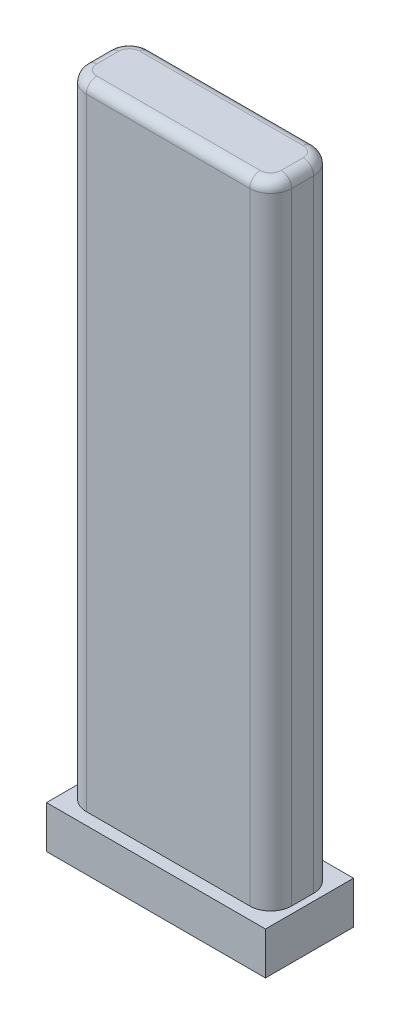
ISO-10303-21;
HEADER;
FILE_DESCRIPTION(('STEP AP214'),'2;1');
FILE_NAME('part.step','',(''),(''),'','','');
FILE_SCHEMA(('AUTOMOTIVE_DESIGN { 1 0 10303 214 1 1 1 1 }'));
ENDSEC;
DATA;
#1=APPLICATION_CONTEXT('core data for automotive mechanical design processes');
#2=APPLICATION_PROTOCOL_DEFINITION('international standard','automotive_design',2000,#1);
#3=PRODUCT_CONTEXT('',#1,'mechanical');
#4=PRODUCT('Part','Part','',(#3));
#5=PRODUCT_RELATED_PRODUCT_CATEGORY('part','',(#4));
#6=PRODUCT_DEFINITION_FORMATION('','',#4);
#7=PRODUCT_DEFINITION_CONTEXT('part definition',#1,'design');
#8=PRODUCT_DEFINITION('design','',#6,#7);
#9=PRODUCT_DEFINITION_SHAPE('','',#8);
#10=(LENGTH_UNIT() NAMED_UNIT(*) SI_UNIT(.MILLI.,.METRE.));
#11=(NAMED_UNIT(*) PLANE_ANGLE_UNIT() SI_UNIT($,.RADIAN.));
#12=(NAMED_UNIT(*) SI_UNIT($,.STERADIAN.) SOLID_ANGLE_UNIT());
#13=UNCERTAINTY_MEASURE_WITH_UNIT(LENGTH_MEASURE(1.E-05),#10,'distance_accuracy_value','');
#14=(GEOMETRIC_REPRESENTATION_CONTEXT(3) GLOBAL_UNCERTAINTY_ASSIGNED_CONTEXT((#13)) GLOBAL_UNIT_ASSIGNED_CONTEXT((#10,
#11,#12)) REPRESENTATION_CONTEXT('',''));
#15=CARTESIAN_POINT('',(0.,0.,0.));
#16=DIRECTION('',(0.,0.,1.));
#17=DIRECTION('',(1.,0.,0.));
#18=AXIS2_PLACEMENT_3D('',#15,#16,#17);
#19=CARTESIAN_POINT('',(7.80000000000001,60.3,1.05));
#20=DIRECTION('',(0.,-1.,0.));
#21=DIRECTION('',(0.,0.,-1.));
#22=AXIS2_PLACEMENT_3D('',#19,#20,#21);
#23=CYLINDRICAL_SURFACE('',#22,2.);
#24=DIRECTION('',(0.,-1.,0.));
#25=VECTOR('',#24,1.);
#26=CARTESIAN_POINT('',(9.80000000000001,60.3,1.05));
#27=LINE('',#26,#25);
#28=CARTESIAN_POINT('',(9.80000000000001,59.3,1.05));
#29=VERTEX_POINT('',#28);
#30=CARTESIAN_POINT('',(9.80000000000001,0.,1.05));
#31=VERTEX_POINT('',#30);
#32=EDGE_CURVE('E237',#29,#31,#27,.T.);
#33=ORIENTED_EDGE('',*,*,#32,.F.);
#34=CARTESIAN_POINT('',(7.80000000000001,59.3,1.05));
#35=DIRECTION('',(0.,1.,0.));
#36=DIRECTION('',(0.,0.,1.));
#37=AXIS2_PLACEMENT_3D('',#34,#35,#36);
#38=CIRCLE('',#37,2.);
#39=CARTESIAN_POINT('',(7.80000000000001,59.3,3.05));
#40=VERTEX_POINT('',#39);
#41=EDGE_CURVE('E272',#29,#40,#38,.F.);
#42=ORIENTED_EDGE('',*,*,#41,.T.);
#43=DIRECTION('',(0.,-1.,0.));
#44=VECTOR('',#43,1.);
#45=CARTESIAN_POINT('',(7.80000000000001,60.3,3.05));
#46=LINE('',#45,#44);
#47=CARTESIAN_POINT('',(7.80000000000001,0.,3.05));
#48=VERTEX_POINT('',#47);
#49=EDGE_CURVE('E224',#40,#48,#46,.T.);
#50=ORIENTED_EDGE('',*,*,#49,.T.);
#51=CARTESIAN_POINT('',(7.80000000000001,0.,1.05));
#52=DIRECTION('',(0.,1.,0.));
#53=DIRECTION('',(0.,0.,1.));
#54=AXIS2_PLACEMENT_3D('',#51,#52,#53);
#55=CIRCLE('',#54,2.);
#56=EDGE_CURVE('E198',#48,#31,#55,.T.);
#57=ORIENTED_EDGE('',*,*,#56,.T.);
#58=EDGE_LOOP('',(#33,#42,#50,#57));
#59=FACE_BOUND('',#58,.T.);
#60=ADVANCED_FACE('F41',(#59),#23,.T.);
#61=CARTESIAN_POINT('',(9.8,60.3,-1.05));
#62=DIRECTION('',(-1.,0.,0.));
#63=DIRECTION('',(0.,0.,1.));
#64=AXIS2_PLACEMENT_3D('',#61,#62,#63);
#65=PLANE('',#64);
#66=DIRECTION('',(0.,-1.,0.));
#67=VECTOR('',#66,1.);
#68=CARTESIAN_POINT('',(9.8,60.3,-1.05));
#69=LINE('',#68,#67);
#70=CARTESIAN_POINT('',(9.8,59.3,-1.05));
#71=VERTEX_POINT('',#70);
#72=CARTESIAN_POINT('',(9.8,0.,-1.05));
#73=VERTEX_POINT('',#72);
#74=EDGE_CURVE('E240',#71,#73,#69,.T.);
#75=ORIENTED_EDGE('',*,*,#74,.F.);
#76=DIRECTION('',(0.,0.,-1.));
#77=VECTOR('',#76,1.);
#78=CARTESIAN_POINT('',(9.80000000000001,59.3,1.05));
#79=LINE('',#78,#77);
#80=EDGE_CURVE('E268',#71,#29,#79,.F.);
#81=ORIENTED_EDGE('',*,*,#80,.T.);
#82=ORIENTED_EDGE('',*,*,#32,.T.);
#83=DIRECTION('',(0.,0.,-1.));
#84=VECTOR('',#83,1.);
#85=CARTESIAN_POINT('',(9.8,0.,-1.05));
#86=LINE('',#85,#84);
#87=EDGE_CURVE('E203',#31,#73,#86,.T.);
#88=ORIENTED_EDGE('',*,*,#87,.T.);
#89=EDGE_LOOP('',(#75,#81,#82,#88));
#90=FACE_BOUND('',#89,.T.);
#91=ADVANCED_FACE('F344',(#90),#65,.F.);
#92=CARTESIAN_POINT('',(7.80000000000001,60.3,-1.05));
#93=DIRECTION('',(0.,-1.,0.));
#94=DIRECTION('',(0.,0.,-1.));
#95=AXIS2_PLACEMENT_3D('',#92,#93,#94);
#96=CYLINDRICAL_SURFACE('',#95,2.);
#97=DIRECTION('',(0.,-1.,0.));
#98=VECTOR('',#97,1.);
#99=CARTESIAN_POINT('',(7.80000000000001,60.3,-3.05));
#100=LINE('',#99,#98);
#101=CARTESIAN_POINT('',(7.80000000000001,59.3,-3.05));
#102=VERTEX_POINT('',#101);
#103=CARTESIAN_POINT('',(7.80000000000001,0.,-3.05));
#104=VERTEX_POINT('',#103);
#105=EDGE_CURVE('E232',#102,#104,#100,.T.);
#106=ORIENTED_EDGE('',*,*,#105,.F.);
#107=CARTESIAN_POINT('',(7.80000000000001,59.3,-1.05));
#108=DIRECTION('',(0.,1.,0.));
#109=DIRECTION('',(0.,0.,1.));
#110=AXIS2_PLACEMENT_3D('',#107,#108,#109);
#111=CIRCLE('',#110,2.);
#112=EDGE_CURVE('E270',#102,#71,#111,.F.);
#113=ORIENTED_EDGE('',*,*,#112,.T.);
#114=ORIENTED_EDGE('',*,*,#74,.T.);
#115=CARTESIAN_POINT('',(7.80000000000001,0.,-1.05));
#116=DIRECTION('',(0.,1.,0.));
#117=DIRECTION('',(0.,0.,-1.));
#118=AXIS2_PLACEMENT_3D('',#115,#116,#117);
#119=CIRCLE('',#118,2.);
#120=EDGE_CURVE('E210',#73,#104,#119,.T.);
#121=ORIENTED_EDGE('',*,*,#120,.T.);
#122=EDGE_LOOP('',(#106,#113,#114,#121));
#123=FACE_BOUND('',#122,.T.);
#124=ADVANCED_FACE('F355',(#123),#96,.T.);
#125=CARTESIAN_POINT('',(-7.8,60.3,-3.05));
#126=DIRECTION('',(0.,0.,1.));
#127=DIRECTION('',(1.,0.,0.));
#128=AXIS2_PLACEMENT_3D('',#125,#126,#127);
#129=PLANE('',#128);
#130=DIRECTION('',(0.,-1.,0.));
#131=VECTOR('',#130,1.);
#132=CARTESIAN_POINT('',(-7.8,60.3,-3.05));
#133=LINE('',#132,#131);
#134=CARTESIAN_POINT('',(-7.8,59.3,-3.05));
#135=VERTEX_POINT('',#134);
#136=CARTESIAN_POINT('',(-7.8,0.,-3.05));
#137=VERTEX_POINT('',#136);
#138=EDGE_CURVE('E231',#135,#137,#133,.T.);
#139=ORIENTED_EDGE('',*,*,#138,.F.);
#140=DIRECTION('',(-1.,0.,0.));
#141=VECTOR('',#140,1.);
#142=CARTESIAN_POINT('',(7.80000000000001,59.3,-3.05));
#143=LINE('',#142,#141);
#144=EDGE_CURVE('E264',#135,#102,#143,.F.);
#145=ORIENTED_EDGE('',*,*,#144,.T.);
#146=ORIENTED_EDGE('',*,*,#105,.T.);
#147=DIRECTION('',(-1.,0.,0.));
#148=VECTOR('',#147,1.);
#149=CARTESIAN_POINT('',(-7.8,0.,-3.05));
#150=LINE('',#149,#148);
#151=EDGE_CURVE('E208',#104,#137,#150,.T.);
#152=ORIENTED_EDGE('',*,*,#151,.T.);
#153=EDGE_LOOP('',(#139,#145,#146,#152));
#154=FACE_BOUND('',#153,.T.);
#155=ADVANCED_FACE('F496',(#154),#129,.F.);
#156=CARTESIAN_POINT('',(-7.8,60.3,-1.05));
#157=DIRECTION('',(0.,-1.,0.));
#158=DIRECTION('',(0.,0.,-1.));
#159=AXIS2_PLACEMENT_3D('',#156,#157,#158);
#160=CYLINDRICAL_SURFACE('',#159,2.);
#161=DIRECTION('',(0.,-1.,0.));
#162=VECTOR('',#161,1.);
#163=CARTESIAN_POINT('',(-9.8,60.3,-1.05));
#164=LINE('',#163,#162);
#165=CARTESIAN_POINT('',(-9.8,59.3,-1.05));
#166=VERTEX_POINT('',#165);
#167=CARTESIAN_POINT('',(-9.8,0.,-1.05));
#168=VERTEX_POINT('',#167);
#169=EDGE_CURVE('E233',#166,#168,#164,.T.);
#170=ORIENTED_EDGE('',*,*,#169,.F.);
#171=CARTESIAN_POINT('',(-7.8,59.3,-1.05));
#172=DIRECTION('',(0.,1.,0.));
#173=DIRECTION('',(0.,0.,1.));
#174=AXIS2_PLACEMENT_3D('',#171,#172,#173);
#175=CIRCLE('',#174,2.);
#176=EDGE_CURVE('E263',#166,#135,#175,.F.);
#177=ORIENTED_EDGE('',*,*,#176,.T.);
#178=ORIENTED_EDGE('',*,*,#138,.T.);
#179=CARTESIAN_POINT('',(-7.8,0.,-1.05));
#180=DIRECTION('',(0.,1.,0.));
#181=DIRECTION('',(0.,0.,1.));
#182=AXIS2_PLACEMENT_3D('',#179,#180,#181);
#183=CIRCLE('',#182,2.);
#184=EDGE_CURVE('E212',#137,#168,#183,.T.);
#185=ORIENTED_EDGE('',*,*,#184,.T.);
#186=EDGE_LOOP('',(#170,#177,#178,#185));
#187=FACE_BOUND('',#186,.T.);
#188=ADVANCED_FACE('F488',(#187),#160,.T.);
#189=CARTESIAN_POINT('',(-9.8,60.3,-1.05));
#190=DIRECTION('',(1.,0.,0.));
#191=DIRECTION('',(0.,0.,-1.));
#192=AXIS2_PLACEMENT_3D('',#189,#190,#191);
#193=PLANE('',#192);
#194=DIRECTION('',(0.,-1.,0.));
#195=VECTOR('',#194,1.);
#196=CARTESIAN_POINT('',(-9.8,60.3,1.05));
#197=LINE('',#196,#195);
#198=CARTESIAN_POINT('',(-9.8,59.3,1.05));
#199=VERTEX_POINT('',#198);
#200=CARTESIAN_POINT('',(-9.8,0.,1.05));
#201=VERTEX_POINT('',#200);
#202=EDGE_CURVE('E230',#199,#201,#197,.T.);
#203=ORIENTED_EDGE('',*,*,#202,.F.);
#204=DIRECTION('',(0.,0.,1.));
#205=VECTOR('',#204,1.);
#206=CARTESIAN_POINT('',(-9.8,59.3,-1.05));
#207=LINE('',#206,#205);
#208=EDGE_CURVE('E261',#199,#166,#207,.F.);
#209=ORIENTED_EDGE('',*,*,#208,.T.);
#210=ORIENTED_EDGE('',*,*,#169,.T.);
#211=DIRECTION('',(0.,0.,1.));
#212=VECTOR('',#211,1.);
#213=CARTESIAN_POINT('',(-9.8,0.,-1.05));
#214=LINE('',#213,#212);
#215=EDGE_CURVE('E216',#168,#201,#214,.T.);
#216=ORIENTED_EDGE('',*,*,#215,.T.);
#217=EDGE_LOOP('',(#203,#209,#210,#216));
#218=FACE_BOUND('',#217,.T.);
#219=ADVANCED_FACE('F476',(#218),#193,.F.);
#220=CARTESIAN_POINT('',(-7.8,60.3,1.05));
#221=DIRECTION('',(0.,-1.,0.));
#222=DIRECTION('',(0.,0.,-1.));
#223=AXIS2_PLACEMENT_3D('',#220,#221,#222);
#224=CYLINDRICAL_SURFACE('',#223,2.);
#225=DIRECTION('',(0.,-1.,0.));
#226=VECTOR('',#225,1.);
#227=CARTESIAN_POINT('',(-7.8,60.3,3.05));
#228=LINE('',#227,#226);
#229=CARTESIAN_POINT('',(-7.8,59.3,3.05));
#230=VERTEX_POINT('',#229);
#231=CARTESIAN_POINT('',(-7.8,0.,3.05));
#232=VERTEX_POINT('',#231);
#233=EDGE_CURVE('E227',#230,#232,#228,.T.);
#234=ORIENTED_EDGE('',*,*,#233,.F.);
#235=CARTESIAN_POINT('',(-7.8,59.3,1.05));
#236=DIRECTION('',(0.,1.,0.));
#237=DIRECTION('',(0.,0.,1.));
#238=AXIS2_PLACEMENT_3D('',#235,#236,#237);
#239=CIRCLE('',#238,2.);
#240=EDGE_CURVE('E257',#230,#199,#239,.F.);
#241=ORIENTED_EDGE('',*,*,#240,.T.);
#242=ORIENTED_EDGE('',*,*,#202,.T.);
#243=CARTESIAN_POINT('',(-7.8,0.,1.05));
#244=DIRECTION('',(0.,1.,0.));
#245=DIRECTION('',(0.,0.,1.));
#246=AXIS2_PLACEMENT_3D('',#243,#244,#245);
#247=CIRCLE('',#246,2.);
#248=EDGE_CURVE('E217',#201,#232,#247,.T.);
#249=ORIENTED_EDGE('',*,*,#248,.T.);
#250=EDGE_LOOP('',(#234,#241,#242,#249));
#251=FACE_BOUND('',#250,.T.);
#252=ADVANCED_FACE('F467',(#251),#224,.T.);
#253=CARTESIAN_POINT('',(-7.8,60.3,3.05));
#254=DIRECTION('',(0.,0.,-1.));
#255=DIRECTION('',(-1.,0.,0.));
#256=AXIS2_PLACEMENT_3D('',#253,#254,#255);
#257=PLANE('',#256);
#258=ORIENTED_EDGE('',*,*,#49,.F.);
#259=DIRECTION('',(1.,0.,0.));
#260=VECTOR('',#259,1.);
#261=CARTESIAN_POINT('',(-7.8,59.3,3.05));
#262=LINE('',#261,#260);
#263=EDGE_CURVE('E271',#40,#230,#262,.F.);
#264=ORIENTED_EDGE('',*,*,#263,.T.);
#265=ORIENTED_EDGE('',*,*,#233,.T.);
#266=DIRECTION('',(1.,0.,0.));
#267=VECTOR('',#266,1.);
#268=CARTESIAN_POINT('',(-7.8,0.,3.05));
#269=LINE('',#268,#267);
#270=EDGE_CURVE('E225',#232,#48,#269,.T.);
#271=ORIENTED_EDGE('',*,*,#270,.T.);
#272=EDGE_LOOP('',(#258,#264,#265,#271));
#273=FACE_BOUND('',#272,.T.);
#274=ADVANCED_FACE('F456',(#273),#257,.F.);
#275=CARTESIAN_POINT('',(7.80000000000001,60.3,1.05));
#276=DIRECTION('',(0.,1.,0.));
#277=DIRECTION('',(0.,0.,1.));
#278=AXIS2_PLACEMENT_3D('',#275,#276,#277);
#279=PLANE('',#278);
#280=DIRECTION('',(0.,0.,1.));
#281=VECTOR('',#280,1.);
#282=CARTESIAN_POINT('',(-8.8,60.3,1.05));
#283=LINE('',#282,#281);
#284=CARTESIAN_POINT('',(-8.8,60.3,-1.05));
#285=VERTEX_POINT('',#284);
#286=CARTESIAN_POINT('',(-8.8,60.3,1.05));
#287=VERTEX_POINT('',#286);
#288=EDGE_CURVE('E254',#285,#287,#283,.T.);
#289=ORIENTED_EDGE('',*,*,#288,.T.);
#290=CARTESIAN_POINT('',(-7.8,60.3,1.05));
#291=DIRECTION('',(0.,1.,0.));
#292=DIRECTION('',(0.,0.,1.));
#293=AXIS2_PLACEMENT_3D('',#290,#291,#292);
#294=CIRCLE('',#293,0.999999999999999);
#295=CARTESIAN_POINT('',(-7.8,60.3,2.05));
#296=VERTEX_POINT('',#295);
#297=EDGE_CURVE('E253',#287,#296,#294,.T.);
#298=ORIENTED_EDGE('',*,*,#297,.T.);
#299=DIRECTION('',(1.,0.,0.));
#300=VECTOR('',#299,1.);
#301=CARTESIAN_POINT('',(7.80000000000001,60.3,2.05));
#302=LINE('',#301,#300);
#303=CARTESIAN_POINT('',(7.80000000000001,60.3,2.05));
#304=VERTEX_POINT('',#303);
#305=EDGE_CURVE('E241',#296,#304,#302,.T.);
#306=ORIENTED_EDGE('',*,*,#305,.T.);
#307=CARTESIAN_POINT('',(7.80000000000001,60.3,1.05));
#308=DIRECTION('',(0.,1.,0.));
#309=DIRECTION('',(0.,0.,1.));
#310=AXIS2_PLACEMENT_3D('',#307,#308,#309);
#311=CIRCLE('',#310,1.);
#312=CARTESIAN_POINT('',(8.80000000000001,60.3,1.05));
#313=VERTEX_POINT('',#312);
#314=EDGE_CURVE('E243',#304,#313,#311,.T.);
#315=ORIENTED_EDGE('',*,*,#314,.T.);
#316=DIRECTION('',(0.,0.,-1.));
#317=VECTOR('',#316,1.);
#318=CARTESIAN_POINT('',(8.80000000000001,60.3,-1.05));
#319=LINE('',#318,#317);
#320=CARTESIAN_POINT('',(8.80000000000001,60.3,-1.05));
#321=VERTEX_POINT('',#320);
#322=EDGE_CURVE('E244',#313,#321,#319,.T.);
#323=ORIENTED_EDGE('',*,*,#322,.T.);
#324=CARTESIAN_POINT('',(7.80000000000001,60.3,-1.05));
#325=DIRECTION('',(0.,1.,0.));
#326=DIRECTION('',(0.,0.,1.));
#327=AXIS2_PLACEMENT_3D('',#324,#325,#326);
#328=CIRCLE('',#327,1.);
#329=CARTESIAN_POINT('',(7.80000000000001,60.3,-2.05));
#330=VERTEX_POINT('',#329);
#331=EDGE_CURVE('E250',#321,#330,#328,.T.);
#332=ORIENTED_EDGE('',*,*,#331,.T.);
#333=DIRECTION('',(-1.,0.,0.));
#334=VECTOR('',#333,1.);
#335=CARTESIAN_POINT('',(-7.8,60.3,-2.05));
#336=LINE('',#335,#334);
#337=CARTESIAN_POINT('',(-7.8,60.3,-2.05));
#338=VERTEX_POINT('',#337);
#339=EDGE_CURVE('E248',#330,#338,#336,.T.);
#340=ORIENTED_EDGE('',*,*,#339,.T.);
#341=CARTESIAN_POINT('',(-7.8,60.3,-1.05));
#342=DIRECTION('',(0.,1.,0.));
#343=DIRECTION('',(0.,0.,1.));
#344=AXIS2_PLACEMENT_3D('',#341,#342,#343);
#345=CIRCLE('',#344,1.);
#346=EDGE_CURVE('E252',#338,#285,#345,.T.);
#347=ORIENTED_EDGE('',*,*,#346,.T.);
#348=EDGE_LOOP('',(#289,#298,#306,#315,#323,#332,#340,#347));
#349=FACE_BOUND('',#348,.T.);
#350=ADVANCED_FACE('F449',(#349),#279,.T.);
#351=CARTESIAN_POINT('',(0.,0.,0.));
#352=DIRECTION('',(0.,1.,0.));
#353=DIRECTION('',(0.,0.,1.));
#354=AXIS2_PLACEMENT_3D('',#351,#352,#353);
#355=PLANE('',#354);
#356=DIRECTION('',(0.,0.,-1.));
#357=VECTOR('',#356,1.);
#358=CARTESIAN_POINT('',(10.45,0.,-4.2));
#359=LINE('',#358,#357);
#360=CARTESIAN_POINT('',(10.45,0.,4.2));
#361=VERTEX_POINT('',#360);
#362=CARTESIAN_POINT('',(10.45,0.,-4.2));
#363=VERTEX_POINT('',#362);
#364=EDGE_CURVE('E169',#361,#363,#359,.T.);
#365=ORIENTED_EDGE('',*,*,#364,.T.);
#366=DIRECTION('',(-1.,0.,0.));
#367=VECTOR('',#366,1.);
#368=CARTESIAN_POINT('',(-10.45,0.,-4.2));
#369=LINE('',#368,#367);
#370=CARTESIAN_POINT('',(-10.45,0.,-4.2));
#371=VERTEX_POINT('',#370);
#372=EDGE_CURVE('E180',#363,#371,#369,.T.);
#373=ORIENTED_EDGE('',*,*,#372,.T.);
#374=DIRECTION('',(0.,0.,1.));
#375=VECTOR('',#374,1.);
#376=CARTESIAN_POINT('',(-10.45,0.,-4.2));
#377=LINE('',#376,#375);
#378=CARTESIAN_POINT('',(-10.45,0.,4.2));
#379=VERTEX_POINT('',#378);
#380=EDGE_CURVE('E182',#371,#379,#377,.T.);
#381=ORIENTED_EDGE('',*,*,#380,.T.);
#382=DIRECTION('',(1.,0.,0.));
#383=VECTOR('',#382,1.);
#384=CARTESIAN_POINT('',(-10.45,0.,4.2));
#385=LINE('',#384,#383);
#386=EDGE_CURVE('E172',#379,#361,#385,.T.);
#387=ORIENTED_EDGE('',*,*,#386,.T.);
#388=EDGE_LOOP('',(#365,#373,#381,#387));
#389=FACE_BOUND('',#388,.T.);
#390=ORIENTED_EDGE('',*,*,#56,.F.);
#391=ORIENTED_EDGE('',*,*,#270,.F.);
#392=ORIENTED_EDGE('',*,*,#248,.F.);
#393=ORIENTED_EDGE('',*,*,#215,.F.);
#394=ORIENTED_EDGE('',*,*,#184,.F.);
#395=ORIENTED_EDGE('',*,*,#151,.F.);
#396=ORIENTED_EDGE('',*,*,#120,.F.);
#397=ORIENTED_EDGE('',*,*,#87,.F.);
#398=EDGE_LOOP('',(#390,#391,#392,#393,#394,#395,#396,#397));
#399=FACE_BOUND('',#398,.T.);
#400=ADVANCED_FACE('F184',(#389,#399),#355,.T.);
#401=CARTESIAN_POINT('',(10.45,-4.55,-4.2));
#402=DIRECTION('',(1.,0.,0.));
#403=DIRECTION('',(0.,0.,-1.));
#404=AXIS2_PLACEMENT_3D('',#401,#402,#403);
#405=PLANE('',#404);
#406=DIRECTION('',(0.,1.,0.));
#407=VECTOR('',#406,1.);
#408=CARTESIAN_POINT('',(10.45,-4.55,4.2));
#409=LINE('',#408,#407);
#410=CARTESIAN_POINT('',(10.45,-4.05,4.2));
#411=VERTEX_POINT('',#410);
#412=EDGE_CURVE('E196',#411,#361,#409,.T.);
#413=ORIENTED_EDGE('',*,*,#412,.F.);
#414=DIRECTION('',(0.,0.,-1.));
#415=VECTOR('',#414,1.);
#416=CARTESIAN_POINT('',(10.45,-4.05,-4.2));
#417=LINE('',#416,#415);
#418=CARTESIAN_POINT('',(10.45,-4.05,-4.2));
#419=VERTEX_POINT('',#418);
#420=EDGE_CURVE('E51',#411,#419,#417,.T.);
#421=ORIENTED_EDGE('',*,*,#420,.T.);
#422=DIRECTION('',(0.,1.,0.));
#423=VECTOR('',#422,1.);
#424=CARTESIAN_POINT('',(10.45,-4.55,-4.2));
#425=LINE('',#424,#423);
#426=EDGE_CURVE('E164',#419,#363,#425,.T.);
#427=ORIENTED_EDGE('',*,*,#426,.T.);
#428=ORIENTED_EDGE('',*,*,#364,.F.);
#429=EDGE_LOOP('',(#413,#421,#427,#428));
#430=FACE_BOUND('',#429,.T.);
#431=ADVANCED_FACE('F170',(#430),#405,.T.);
#432=CARTESIAN_POINT('',(-10.45,-4.55,4.2));
#433=DIRECTION('',(0.,0.,1.));
#434=DIRECTION('',(1.,0.,0.));
#435=AXIS2_PLACEMENT_3D('',#432,#433,#434);
#436=PLANE('',#435);
#437=DIRECTION('',(0.,1.,0.));
#438=VECTOR('',#437,1.);
#439=CARTESIAN_POINT('',(-10.45,-4.55,4.2));
#440=LINE('',#439,#438);
#441=CARTESIAN_POINT('',(-10.45,-4.05,4.2));
#442=VERTEX_POINT('',#441);
#443=EDGE_CURVE('E197',#442,#379,#440,.T.);
#444=ORIENTED_EDGE('',*,*,#443,.F.);
#445=DIRECTION('',(1.,0.,0.));
#446=VECTOR('',#445,1.);
#447=CARTESIAN_POINT('',(10.45,-4.05,4.2));
#448=LINE('',#447,#446);
#449=EDGE_CURVE('E11',#442,#411,#448,.T.);
#450=ORIENTED_EDGE('',*,*,#449,.T.);
#451=ORIENTED_EDGE('',*,*,#412,.T.);
#452=ORIENTED_EDGE('',*,*,#386,.F.);
#453=EDGE_LOOP('',(#444,#450,#451,#452));
#454=FACE_BOUND('',#453,.T.);
#455=ADVANCED_FACE('F333',(#454),#436,.T.);
#456=CARTESIAN_POINT('',(-10.45,-4.55,-4.2));
#457=DIRECTION('',(-1.,0.,0.));
#458=DIRECTION('',(0.,0.,1.));
#459=AXIS2_PLACEMENT_3D('',#456,#457,#458);
#460=PLANE('',#459);
#461=DIRECTION('',(0.,1.,0.));
#462=VECTOR('',#461,1.);
#463=CARTESIAN_POINT('',(-10.45,-4.55,-4.2));
#464=LINE('',#463,#462);
#465=CARTESIAN_POINT('',(-10.45,-4.05,-4.2));
#466=VERTEX_POINT('',#465);
#467=EDGE_CURVE('E173',#466,#371,#464,.T.);
#468=ORIENTED_EDGE('',*,*,#467,.F.);
#469=DIRECTION('',(0.,0.,1.));
#470=VECTOR('',#469,1.);
#471=CARTESIAN_POINT('',(-10.45,-4.05,4.2));
#472=LINE('',#471,#470);
#473=EDGE_CURVE('E273',#466,#442,#472,.T.);
#474=ORIENTED_EDGE('',*,*,#473,.T.);
#475=ORIENTED_EDGE('',*,*,#443,.T.);
#476=ORIENTED_EDGE('',*,*,#380,.F.);
#477=EDGE_LOOP('',(#468,#474,#475,#476));
#478=FACE_BOUND('',#477,.T.);
#479=ADVANCED_FACE('F332',(#478),#460,.T.);
#480=CARTESIAN_POINT('',(-10.45,-4.55,-4.2));
#481=DIRECTION('',(0.,0.,-1.));
#482=DIRECTION('',(-1.,0.,0.));
#483=AXIS2_PLACEMENT_3D('',#480,#481,#482);
#484=PLANE('',#483);
#485=ORIENTED_EDGE('',*,*,#426,.F.);
#486=DIRECTION('',(-1.,0.,0.));
#487=VECTOR('',#486,1.);
#488=CARTESIAN_POINT('',(-10.45,-4.05,-4.2));
#489=LINE('',#488,#487);
#490=EDGE_CURVE('E304',#419,#466,#489,.T.);
#491=ORIENTED_EDGE('',*,*,#490,.T.);
#492=ORIENTED_EDGE('',*,*,#467,.T.);
#493=ORIENTED_EDGE('',*,*,#372,.F.);
#494=EDGE_LOOP('',(#485,#491,#492,#493));
#495=FACE_BOUND('',#494,.T.);
#496=ADVANCED_FACE('F178',(#495),#484,.T.);
#497=CARTESIAN_POINT('',(0.,-4.55,0.));
#498=DIRECTION('',(0.,1.,0.));
#499=DIRECTION('',(0.,0.,1.));
#500=AXIS2_PLACEMENT_3D('',#497,#498,#499);
#501=PLANE('',#500);
#502=DIRECTION('',(-1.,0.,0.));
#503=VECTOR('',#502,1.);
#504=CARTESIAN_POINT('',(-10.45,-4.55,3.70000000000001));
#505=LINE('',#504,#503);
#506=CARTESIAN_POINT('',(9.95,-4.55,3.70000000000001));
#507=VERTEX_POINT('',#506);
#508=CARTESIAN_POINT('',(-9.95000000000001,-4.55,3.70000000000001));
#509=VERTEX_POINT('',#508);
#510=EDGE_CURVE('E298',#507,#509,#505,.T.);
#511=ORIENTED_EDGE('',*,*,#510,.T.);
#512=DIRECTION('',(0.,0.,-1.));
#513=VECTOR('',#512,1.);
#514=CARTESIAN_POINT('',(-9.95000000000001,-4.55,-4.2));
#515=LINE('',#514,#513);
#516=CARTESIAN_POINT('',(-9.95000000000001,-4.55,-3.70000000000001));
#517=VERTEX_POINT('',#516);
#518=EDGE_CURVE('E305',#509,#517,#515,.T.);
#519=ORIENTED_EDGE('',*,*,#518,.T.);
#520=DIRECTION('',(1.,0.,0.));
#521=VECTOR('',#520,1.);
#522=CARTESIAN_POINT('',(10.45,-4.55,-3.70000000000001));
#523=LINE('',#522,#521);
#524=CARTESIAN_POINT('',(9.95,-4.55,-3.70000000000001));
#525=VERTEX_POINT('',#524);
#526=EDGE_CURVE('E297',#517,#525,#523,.T.);
#527=ORIENTED_EDGE('',*,*,#526,.T.);
#528=DIRECTION('',(0.,0.,1.));
#529=VECTOR('',#528,1.);
#530=CARTESIAN_POINT('',(9.95,-4.55,4.2));
#531=LINE('',#530,#529);
#532=EDGE_CURVE('E296',#525,#507,#531,.T.);
#533=ORIENTED_EDGE('',*,*,#532,.T.);
#534=EDGE_LOOP('',(#511,#519,#527,#533));
#535=FACE_BOUND('',#534,.T.);
#536=ADVANCED_FACE('F324',(#535),#501,.F.);
#537=CARTESIAN_POINT('',(7.80000000000001,59.3,-1.05));
#538=DIRECTION('',(0.,1.,0.));
#539=DIRECTION('',(0.,0.,1.));
#540=AXIS2_PLACEMENT_3D('',#537,#538,#539);
#541=DEGENERATE_TOROIDAL_SURFACE('',#540,1.,1.,.T.);
#542=CARTESIAN_POINT('',(8.80000000000001,59.3,-1.05));
#543=DIRECTION('',(0.,0.,1.));
#544=DIRECTION('',(1.,0.,0.));
#545=AXIS2_PLACEMENT_3D('',#542,#543,#544);
#546=CIRCLE('',#545,1.);
#547=EDGE_CURVE('E191',#71,#321,#546,.T.);
#548=ORIENTED_EDGE('',*,*,#547,.F.);
#549=ORIENTED_EDGE('',*,*,#112,.F.);
#550=CARTESIAN_POINT('',(7.80000000000001,59.3,-2.05));
#551=DIRECTION('',(-1.,0.,0.));
#552=DIRECTION('',(0.,0.,1.));
#553=AXIS2_PLACEMENT_3D('',#550,#551,#552);
#554=CIRCLE('',#553,1.);
#555=EDGE_CURVE('E189',#330,#102,#554,.T.);
#556=ORIENTED_EDGE('',*,*,#555,.F.);
#557=ORIENTED_EDGE('',*,*,#331,.F.);
#558=EDGE_LOOP('',(#548,#549,#556,#557));
#559=FACE_BOUND('',#558,.T.);
#560=ADVANCED_FACE('F383',(#559),#541,.T.);
#561=CARTESIAN_POINT('',(7.80000000000001,59.3,-2.05));
#562=DIRECTION('',(1.,0.,0.));
#563=DIRECTION('',(0.,0.,-1.));
#564=AXIS2_PLACEMENT_3D('',#561,#562,#563);
#565=CYLINDRICAL_SURFACE('',#564,1.);
#566=ORIENTED_EDGE('',*,*,#555,.T.);
#567=ORIENTED_EDGE('',*,*,#144,.F.);
#568=CARTESIAN_POINT('',(-7.8,59.3,-2.05));
#569=DIRECTION('',(-1.,0.,0.));
#570=DIRECTION('',(0.,0.,1.));
#571=AXIS2_PLACEMENT_3D('',#568,#569,#570);
#572=CIRCLE('',#571,1.);
#573=EDGE_CURVE('E288',#338,#135,#572,.T.);
#574=ORIENTED_EDGE('',*,*,#573,.F.);
#575=ORIENTED_EDGE('',*,*,#339,.F.);
#576=EDGE_LOOP('',(#566,#567,#574,#575));
#577=FACE_BOUND('',#576,.T.);
#578=ADVANCED_FACE('F382',(#577),#565,.T.);
#579=CARTESIAN_POINT('',(8.80000000000001,59.3,1.05));
#580=DIRECTION('',(0.,0.,1.));
#581=DIRECTION('',(1.,0.,0.));
#582=AXIS2_PLACEMENT_3D('',#579,#580,#581);
#583=CYLINDRICAL_SURFACE('',#582,1.);
#584=ORIENTED_EDGE('',*,*,#547,.T.);
#585=ORIENTED_EDGE('',*,*,#322,.F.);
#586=CARTESIAN_POINT('',(8.80000000000001,59.3,1.05));
#587=DIRECTION('',(0.,0.,1.));
#588=DIRECTION('',(1.,0.,0.));
#589=AXIS2_PLACEMENT_3D('',#586,#587,#588);
#590=CIRCLE('',#589,1.);
#591=EDGE_CURVE('E286',#29,#313,#590,.T.);
#592=ORIENTED_EDGE('',*,*,#591,.F.);
#593=ORIENTED_EDGE('',*,*,#80,.F.);
#594=EDGE_LOOP('',(#584,#585,#592,#593));
#595=FACE_BOUND('',#594,.T.);
#596=ADVANCED_FACE('F380',(#595),#583,.T.);
#597=CARTESIAN_POINT('',(-7.8,59.3,-1.05));
#598=DIRECTION('',(0.,1.,0.));
#599=DIRECTION('',(0.,0.,1.));
#600=AXIS2_PLACEMENT_3D('',#597,#598,#599);
#601=DEGENERATE_TOROIDAL_SURFACE('',#600,1.,1.,.T.);
#602=ORIENTED_EDGE('',*,*,#573,.T.);
#603=ORIENTED_EDGE('',*,*,#176,.F.);
#604=CARTESIAN_POINT('',(-8.8,59.3,-1.05));
#605=DIRECTION('',(0.,0.,1.));
#606=DIRECTION('',(1.,0.,0.));
#607=AXIS2_PLACEMENT_3D('',#604,#605,#606);
#608=CIRCLE('',#607,1.);
#609=EDGE_CURVE('E283',#285,#166,#608,.T.);
#610=ORIENTED_EDGE('',*,*,#609,.F.);
#611=ORIENTED_EDGE('',*,*,#346,.F.);
#612=EDGE_LOOP('',(#602,#603,#610,#611));
#613=FACE_BOUND('',#612,.T.);
#614=ADVANCED_FACE('F373',(#613),#601,.T.);
#615=CARTESIAN_POINT('',(7.80000000000001,59.3,1.05));
#616=DIRECTION('',(0.,1.,0.));
#617=DIRECTION('',(0.,0.,1.));
#618=AXIS2_PLACEMENT_3D('',#615,#616,#617);
#619=TOROIDAL_SURFACE('',#618,1.,1.);
#620=ORIENTED_EDGE('',*,*,#591,.T.);
#621=ORIENTED_EDGE('',*,*,#314,.F.);
#622=CARTESIAN_POINT('',(7.80000000000001,59.3,2.05));
#623=DIRECTION('',(-1.,0.,0.));
#624=DIRECTION('',(0.,0.,1.));
#625=AXIS2_PLACEMENT_3D('',#622,#623,#624);
#626=CIRCLE('',#625,1.);
#627=EDGE_CURVE('E279',#40,#304,#626,.T.);
#628=ORIENTED_EDGE('',*,*,#627,.F.);
#629=ORIENTED_EDGE('',*,*,#41,.F.);
#630=EDGE_LOOP('',(#620,#621,#628,#629));
#631=FACE_BOUND('',#630,.T.);
#632=ADVANCED_FACE('F367',(#631),#619,.T.);
#633=CARTESIAN_POINT('',(-8.8,59.3,1.05000000000001));
#634=DIRECTION('',(0.,0.,-1.));
#635=DIRECTION('',(-1.,0.,0.));
#636=AXIS2_PLACEMENT_3D('',#633,#634,#635);
#637=CYLINDRICAL_SURFACE('',#636,1.);
#638=ORIENTED_EDGE('',*,*,#609,.T.);
#639=ORIENTED_EDGE('',*,*,#208,.F.);
#640=CARTESIAN_POINT('',(-8.8,59.3,1.05));
#641=DIRECTION('',(0.,0.,1.));
#642=DIRECTION('',(1.,0.,0.));
#643=AXIS2_PLACEMENT_3D('',#640,#641,#642);
#644=CIRCLE('',#643,1.);
#645=EDGE_CURVE('E277',#287,#199,#644,.T.);
#646=ORIENTED_EDGE('',*,*,#645,.F.);
#647=ORIENTED_EDGE('',*,*,#288,.F.);
#648=EDGE_LOOP('',(#638,#639,#646,#647));
#649=FACE_BOUND('',#648,.T.);
#650=ADVANCED_FACE('F362',(#649),#637,.T.);
#651=CARTESIAN_POINT('',(7.80000000000001,59.3,2.05));
#652=DIRECTION('',(-1.,0.,0.));
#653=DIRECTION('',(0.,0.,1.));
#654=AXIS2_PLACEMENT_3D('',#651,#652,#653);
#655=CYLINDRICAL_SURFACE('',#654,1.);
#656=ORIENTED_EDGE('',*,*,#627,.T.);
#657=ORIENTED_EDGE('',*,*,#305,.F.);
#658=CARTESIAN_POINT('',(-7.8,59.3,2.05));
#659=DIRECTION('',(-1.,0.,0.));
#660=DIRECTION('',(0.,0.,1.));
#661=AXIS2_PLACEMENT_3D('',#658,#659,#660);
#662=CIRCLE('',#661,1.);
#663=EDGE_CURVE('E276',#230,#296,#662,.T.);
#664=ORIENTED_EDGE('',*,*,#663,.F.);
#665=ORIENTED_EDGE('',*,*,#263,.F.);
#666=EDGE_LOOP('',(#656,#657,#664,#665));
#667=FACE_BOUND('',#666,.T.);
#668=ADVANCED_FACE('F363',(#667),#655,.T.);
#669=CARTESIAN_POINT('',(-7.8,59.3,1.05));
#670=DIRECTION('',(0.,1.,0.));
#671=DIRECTION('',(0.,0.,1.));
#672=AXIS2_PLACEMENT_3D('',#669,#670,#671);
#673=DEGENERATE_TOROIDAL_SURFACE('',#672,0.999999999999999,1.,.T.);
#674=ORIENTED_EDGE('',*,*,#645,.T.);
#675=ORIENTED_EDGE('',*,*,#240,.F.);
#676=ORIENTED_EDGE('',*,*,#663,.T.);
#677=ORIENTED_EDGE('',*,*,#297,.F.);
#678=EDGE_LOOP('',(#674,#675,#676,#677));
#679=FACE_BOUND('',#678,.T.);
#680=ADVANCED_FACE('F356',(#679),#673,.T.);
#681=CARTESIAN_POINT('',(10.45,-4.05,-4.2));
#682=DIRECTION('',(0.707106781186552,-0.707106781186543,0.));
#683=DIRECTION('',(0.,0.,1.));
#684=AXIS2_PLACEMENT_3D('',#681,#682,#683);
#685=PLANE('',#684);
#686=DIRECTION('',(0.577350269189623,0.577350269189631,0.577350269189623));
#687=VECTOR('',#686,1.);
#688=CARTESIAN_POINT('',(3.4833333333334,-11.0166666666667,-2.7666666666666));
#689=LINE('',#688,#687);
#690=EDGE_CURVE('E311',#507,#411,#689,.T.);
#691=ORIENTED_EDGE('',*,*,#690,.F.);
#692=ORIENTED_EDGE('',*,*,#532,.F.);
#693=DIRECTION('',(0.577350269189623,0.577350269189631,-0.577350269189623));
#694=VECTOR('',#693,1.);
#695=CARTESIAN_POINT('',(10.45,-4.05,-4.2));
#696=LINE('',#695,#694);
#697=EDGE_CURVE('E46',#419,#525,#696,.F.);
#698=ORIENTED_EDGE('',*,*,#697,.F.);
#699=ORIENTED_EDGE('',*,*,#420,.F.);
#700=EDGE_LOOP('',(#691,#692,#698,#699));
#701=FACE_BOUND('',#700,.T.);
#702=ADVANCED_FACE('F42',(#701),#685,.T.);
#703=CARTESIAN_POINT('',(-10.45,-4.05,-4.2));
#704=DIRECTION('',(0.,-0.707106781186543,-0.707106781186552));
#705=DIRECTION('',(1.,0.,0.));
#706=AXIS2_PLACEMENT_3D('',#703,#704,#705);
#707=PLANE('',#706);
#708=ORIENTED_EDGE('',*,*,#697,.T.);
#709=ORIENTED_EDGE('',*,*,#526,.F.);
#710=DIRECTION('',(-0.577350269189623,0.577350269189631,-0.577350269189623));
#711=VECTOR('',#710,1.);
#712=CARTESIAN_POINT('',(-10.45,-4.05,-4.2));
#713=LINE('',#712,#711);
#714=EDGE_CURVE('E309',#466,#517,#713,.F.);
#715=ORIENTED_EDGE('',*,*,#714,.F.);
#716=ORIENTED_EDGE('',*,*,#490,.F.);
#717=EDGE_LOOP('',(#708,#709,#715,#716));
#718=FACE_BOUND('',#717,.T.);
#719=ADVANCED_FACE('F318',(#718),#707,.T.);
#720=CARTESIAN_POINT('',(-10.45,-4.05,4.2));
#721=DIRECTION('',(0.,-0.707106781186543,0.707106781186552));
#722=DIRECTION('',(-1.,0.,0.));
#723=AXIS2_PLACEMENT_3D('',#720,#721,#722);
#724=PLANE('',#723);
#725=ORIENTED_EDGE('',*,*,#690,.T.);
#726=ORIENTED_EDGE('',*,*,#449,.F.);
#727=DIRECTION('',(0.577350269189623,-0.577350269189631,-0.577350269189623));
#728=VECTOR('',#727,1.);
#729=CARTESIAN_POINT('',(-10.45,-4.05,4.2));
#730=LINE('',#729,#728);
#731=EDGE_CURVE('E308',#509,#442,#730,.F.);
#732=ORIENTED_EDGE('',*,*,#731,.F.);
#733=ORIENTED_EDGE('',*,*,#510,.F.);
#734=EDGE_LOOP('',(#725,#726,#732,#733));
#735=FACE_BOUND('',#734,.T.);
#736=ADVANCED_FACE('F331',(#735),#724,.T.);
#737=CARTESIAN_POINT('',(-10.45,-4.05,-4.2));
#738=DIRECTION('',(-0.707106781186552,-0.707106781186543,0.));
#739=DIRECTION('',(0.,0.,-1.));
#740=AXIS2_PLACEMENT_3D('',#737,#738,#739);
#741=PLANE('',#740);
#742=ORIENTED_EDGE('',*,*,#714,.T.);
#743=ORIENTED_EDGE('',*,*,#518,.F.);
#744=ORIENTED_EDGE('',*,*,#731,.T.);
#745=ORIENTED_EDGE('',*,*,#473,.F.);
#746=EDGE_LOOP('',(#742,#743,#744,#745));
#747=FACE_BOUND('',#746,.T.);
#748=ADVANCED_FACE('F327',(#747),#741,.T.);
#749=CLOSED_SHELL('',(#60,#91,#124,#155,#188,#219,#252,#274,#350,#400,#431,#455,#479,#496,#536,
#560,#578,#596,#614,#632,#650,#668,#680,#702,#719,#736,#748));
#750=MANIFOLD_SOLID_BREP('B2',#749);
#751=ADVANCED_BREP_SHAPE_REPRESENTATION('',(#18,#750),#14);
#752=SHAPE_DEFINITION_REPRESENTATION(#9,#751);
ENDSEC;
END-ISO-10303-21;
